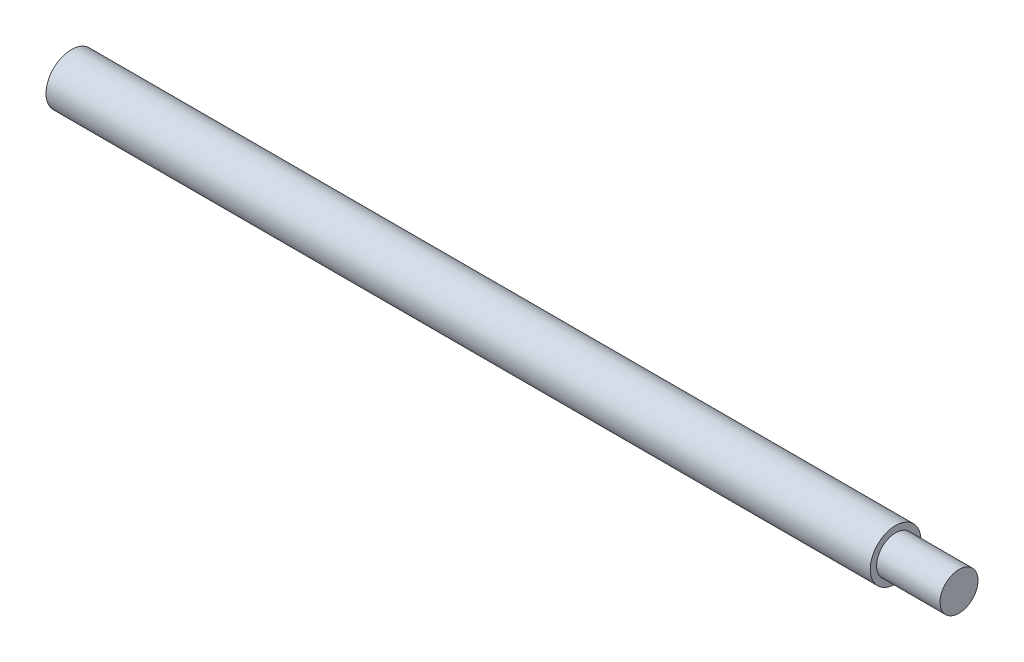
ISO-10303-21;
HEADER;
FILE_DESCRIPTION(('STEP AP214'),'2;1');
FILE_NAME('part.step','',(''),(''),'','','');
FILE_SCHEMA(('AUTOMOTIVE_DESIGN { 1 0 10303 214 1 1 1 1 }'));
ENDSEC;
DATA;
#1=APPLICATION_CONTEXT('core data for automotive mechanical design processes');
#2=APPLICATION_PROTOCOL_DEFINITION('international standard','automotive_design',2000,#1);
#3=PRODUCT_CONTEXT('',#1,'mechanical');
#4=PRODUCT('Part','Part','',(#3));
#5=PRODUCT_RELATED_PRODUCT_CATEGORY('part','',(#4));
#6=PRODUCT_DEFINITION_FORMATION('','',#4);
#7=PRODUCT_DEFINITION_CONTEXT('part definition',#1,'design');
#8=PRODUCT_DEFINITION('design','',#6,#7);
#9=PRODUCT_DEFINITION_SHAPE('','',#8);
#10=(LENGTH_UNIT() NAMED_UNIT(*) SI_UNIT(.MILLI.,.METRE.));
#11=(NAMED_UNIT(*) PLANE_ANGLE_UNIT() SI_UNIT($,.RADIAN.));
#12=(NAMED_UNIT(*) SI_UNIT($,.STERADIAN.) SOLID_ANGLE_UNIT());
#13=UNCERTAINTY_MEASURE_WITH_UNIT(LENGTH_MEASURE(1.E-05),#10,'distance_accuracy_value','');
#14=(GEOMETRIC_REPRESENTATION_CONTEXT(3) GLOBAL_UNCERTAINTY_ASSIGNED_CONTEXT((#13)) GLOBAL_UNIT_ASSIGNED_CONTEXT((#10,
#11,#12)) REPRESENTATION_CONTEXT('',''));
#15=CARTESIAN_POINT('',(0.,0.,0.));
#16=DIRECTION('',(0.,0.,1.));
#17=DIRECTION('',(1.,0.,0.));
#18=AXIS2_PLACEMENT_3D('',#15,#16,#17);
#19=CARTESIAN_POINT('',(70.,0.,0.));
#20=DIRECTION('',(-1.,0.,0.));
#21=DIRECTION('',(0.,0.,1.));
#22=AXIS2_PLACEMENT_3D('',#19,#20,#21);
#23=CYLINDRICAL_SURFACE('',#22,4.);
#24=CARTESIAN_POINT('',(60.,0.,0.));
#25=DIRECTION('',(-1.,0.,0.));
#26=DIRECTION('',(0.,0.,1.));
#27=AXIS2_PLACEMENT_3D('',#24,#25,#26);
#28=CIRCLE('',#27,4.);
#29=CARTESIAN_POINT('',(60.,0.,4.));
#30=VERTEX_POINT('',#29);
#31=EDGE_CURVE('E58',#30,#30,#28,.T.);
#32=ORIENTED_EDGE('',*,*,#31,.T.);
#33=EDGE_LOOP('',(#32));
#34=FACE_BOUND('',#33,.T.);
#35=CARTESIAN_POINT('',(-70.,0.,0.));
#36=DIRECTION('',(1.,0.,0.));
#37=DIRECTION('',(0.,0.,-1.));
#38=AXIS2_PLACEMENT_3D('',#35,#36,#37);
#39=CIRCLE('',#38,4.);
#40=CARTESIAN_POINT('',(-70.,0.,-4.));
#41=VERTEX_POINT('',#40);
#42=EDGE_CURVE('E12',#41,#41,#39,.T.);
#43=ORIENTED_EDGE('',*,*,#42,.T.);
#44=EDGE_LOOP('',(#43));
#45=FACE_BOUND('',#44,.T.);
#46=ADVANCED_FACE('F55',(#34,#45),#23,.T.);
#47=CARTESIAN_POINT('',(-70.,0.,0.));
#48=DIRECTION('',(1.,0.,0.));
#49=DIRECTION('',(0.,0.,-1.));
#50=AXIS2_PLACEMENT_3D('',#47,#48,#49);
#51=PLANE('',#50);
#52=ORIENTED_EDGE('',*,*,#42,.F.);
#53=EDGE_LOOP('',(#52));
#54=FACE_BOUND('',#53,.T.);
#55=ADVANCED_FACE('F89',(#54),#51,.F.);
#56=CARTESIAN_POINT('',(60.,0.,0.));
#57=DIRECTION('',(-1.,0.,0.));
#58=DIRECTION('',(0.,0.,1.));
#59=AXIS2_PLACEMENT_3D('',#56,#57,#58);
#60=PLANE('',#59);
#61=CARTESIAN_POINT('',(60.,0.,0.));
#62=DIRECTION('',(-1.,0.,0.));
#63=DIRECTION('',(0.,0.,1.));
#64=AXIS2_PLACEMENT_3D('',#61,#62,#63);
#65=CIRCLE('',#64,3.);
#66=CARTESIAN_POINT('',(60.,0.,3.));
#67=VERTEX_POINT('',#66);
#68=EDGE_CURVE('E65',#67,#67,#65,.T.);
#69=ORIENTED_EDGE('',*,*,#68,.T.);
#70=EDGE_LOOP('',(#69));
#71=FACE_BOUND('',#70,.T.);
#72=ORIENTED_EDGE('',*,*,#31,.F.);
#73=EDGE_LOOP('',(#72));
#74=FACE_BOUND('',#73,.T.);
#75=ADVANCED_FACE('F73',(#71,#74),#60,.F.);
#76=CARTESIAN_POINT('',(60.,0.,0.));
#77=DIRECTION('',(1.,0.,0.));
#78=DIRECTION('',(0.,0.,-1.));
#79=AXIS2_PLACEMENT_3D('',#76,#77,#78);
#80=CYLINDRICAL_SURFACE('',#79,3.);
#81=ORIENTED_EDGE('',*,*,#68,.F.);
#82=EDGE_LOOP('',(#81));
#83=FACE_BOUND('',#82,.T.);
#84=CARTESIAN_POINT('',(70.,0.,0.));
#85=DIRECTION('',(-1.,0.,0.));
#86=DIRECTION('',(0.,0.,1.));
#87=AXIS2_PLACEMENT_3D('',#84,#85,#86);
#88=CIRCLE('',#87,3.);
#89=CARTESIAN_POINT('',(70.,0.,3.));
#90=VERTEX_POINT('',#89);
#91=EDGE_CURVE('E67',#90,#90,#88,.T.);
#92=ORIENTED_EDGE('',*,*,#91,.T.);
#93=EDGE_LOOP('',(#92));
#94=FACE_BOUND('',#93,.T.);
#95=ADVANCED_FACE('F76',(#83,#94),#80,.T.);
#96=CARTESIAN_POINT('',(70.,0.,0.));
#97=DIRECTION('',(1.,0.,0.));
#98=DIRECTION('',(0.,0.,-1.));
#99=AXIS2_PLACEMENT_3D('',#96,#97,#98);
#100=PLANE('',#99);
#101=ORIENTED_EDGE('',*,*,#91,.F.);
#102=EDGE_LOOP('',(#101));
#103=FACE_BOUND('',#102,.T.);
#104=ADVANCED_FACE('F79',(#103),#100,.T.);
#105=CLOSED_SHELL('',(#46,#55,#75,#95,#104));
#106=MANIFOLD_SOLID_BREP('B2',#105);
#107=ADVANCED_BREP_SHAPE_REPRESENTATION('',(#18,#106),#14);
#108=SHAPE_DEFINITION_REPRESENTATION(#9,#107);
ENDSEC;
END-ISO-10303-21;
